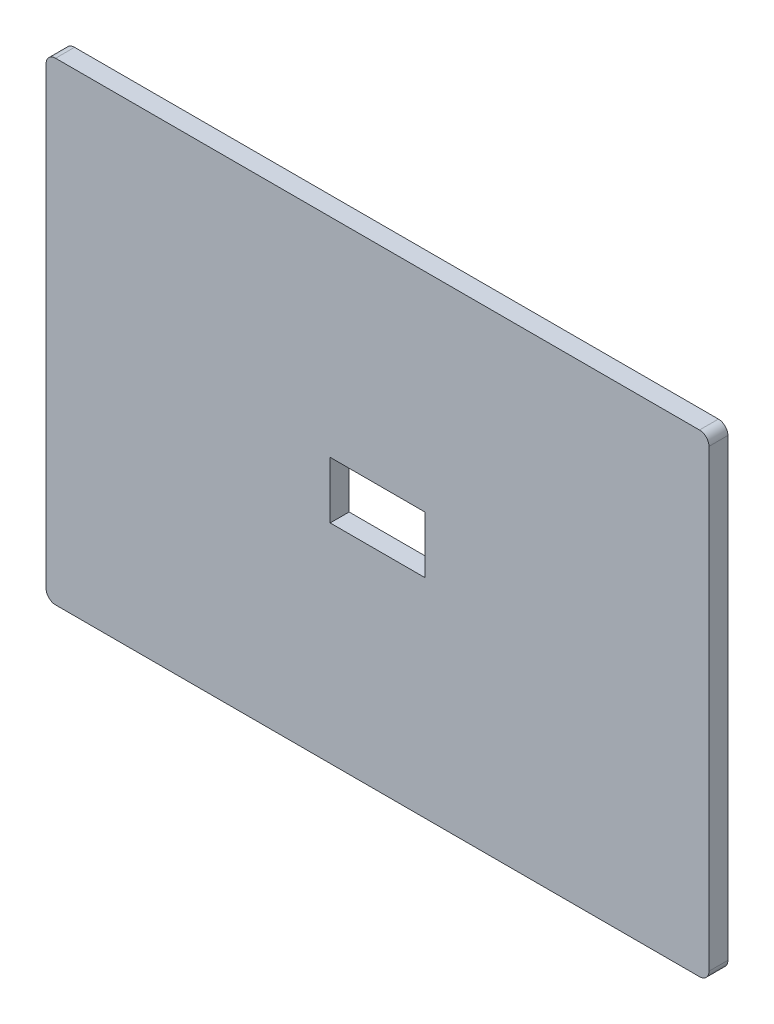
ISO-10303-21;
HEADER;
FILE_DESCRIPTION(('STEP AP214'),'2;1');
FILE_NAME('part.step','',(''),(''),'','','');
FILE_SCHEMA(('AUTOMOTIVE_DESIGN { 1 0 10303 214 1 1 1 1 }'));
ENDSEC;
DATA;
#1=APPLICATION_CONTEXT('core data for automotive mechanical design processes');
#2=APPLICATION_PROTOCOL_DEFINITION('international standard','automotive_design',2000,#1);
#3=PRODUCT_CONTEXT('',#1,'mechanical');
#4=PRODUCT('Part','Part','',(#3));
#5=PRODUCT_RELATED_PRODUCT_CATEGORY('part','',(#4));
#6=PRODUCT_DEFINITION_FORMATION('','',#4);
#7=PRODUCT_DEFINITION_CONTEXT('part definition',#1,'design');
#8=PRODUCT_DEFINITION('design','',#6,#7);
#9=PRODUCT_DEFINITION_SHAPE('','',#8);
#10=(LENGTH_UNIT() NAMED_UNIT(*) SI_UNIT(.MILLI.,.METRE.));
#11=(NAMED_UNIT(*) PLANE_ANGLE_UNIT() SI_UNIT($,.RADIAN.));
#12=(NAMED_UNIT(*) SI_UNIT($,.STERADIAN.) SOLID_ANGLE_UNIT());
#13=UNCERTAINTY_MEASURE_WITH_UNIT(LENGTH_MEASURE(1.E-05),#10,'distance_accuracy_value','');
#14=(GEOMETRIC_REPRESENTATION_CONTEXT(3) GLOBAL_UNCERTAINTY_ASSIGNED_CONTEXT((#13)) GLOBAL_UNIT_ASSIGNED_CONTEXT((#10,
#11,#12)) REPRESENTATION_CONTEXT('',''));
#15=CARTESIAN_POINT('',(0.,0.,0.));
#16=DIRECTION('',(0.,0.,1.));
#17=DIRECTION('',(1.,0.,0.));
#18=AXIS2_PLACEMENT_3D('',#15,#16,#17);
#19=CARTESIAN_POINT('',(-175.,125.,10.));
#20=DIRECTION('',(1.,0.,0.));
#21=DIRECTION('',(0.,1.,0.));
#22=AXIS2_PLACEMENT_3D('',#19,#20,#21);
#23=PLANE('',#22);
#24=DIRECTION('',(0.,-1.,0.));
#25=VECTOR('',#24,1.);
#26=CARTESIAN_POINT('',(-175.,125.,0.));
#27=LINE('',#26,#25);
#28=CARTESIAN_POINT('',(-175.,120.,0.));
#29=VERTEX_POINT('',#28);
#30=CARTESIAN_POINT('',(-175.,-120.,0.));
#31=VERTEX_POINT('',#30);
#32=EDGE_CURVE('E192',#29,#31,#27,.T.);
#33=ORIENTED_EDGE('',*,*,#32,.T.);
#34=DIRECTION('',(0.,0.,-1.));
#35=VECTOR('',#34,1.);
#36=CARTESIAN_POINT('',(-175.,-120.,10.));
#37=LINE('',#36,#35);
#38=CARTESIAN_POINT('',(-175.,-120.,10.));
#39=VERTEX_POINT('',#38);
#40=EDGE_CURVE('E250',#31,#39,#37,.F.);
#41=ORIENTED_EDGE('',*,*,#40,.T.);
#42=DIRECTION('',(0.,-1.,0.));
#43=VECTOR('',#42,1.);
#44=CARTESIAN_POINT('',(-175.,125.,10.));
#45=LINE('',#44,#43);
#46=CARTESIAN_POINT('',(-175.,120.,10.));
#47=VERTEX_POINT('',#46);
#48=EDGE_CURVE('E198',#47,#39,#45,.T.);
#49=ORIENTED_EDGE('',*,*,#48,.F.);
#50=DIRECTION('',(0.,0.,-1.));
#51=VECTOR('',#50,1.);
#52=CARTESIAN_POINT('',(-175.,120.,10.));
#53=LINE('',#52,#51);
#54=EDGE_CURVE('E247',#47,#29,#53,.T.);
#55=ORIENTED_EDGE('',*,*,#54,.T.);
#56=EDGE_LOOP('',(#33,#41,#49,#55));
#57=FACE_BOUND('',#56,.T.);
#58=ADVANCED_FACE('F39',(#57),#23,.F.);
#59=CARTESIAN_POINT('',(-175.,-125.,10.));
#60=DIRECTION('',(0.,1.,0.));
#61=DIRECTION('',(0.,0.,1.));
#62=AXIS2_PLACEMENT_3D('',#59,#60,#61);
#63=PLANE('',#62);
#64=DIRECTION('',(1.,0.,0.));
#65=VECTOR('',#64,1.);
#66=CARTESIAN_POINT('',(-175.,-125.,10.));
#67=LINE('',#66,#65);
#68=CARTESIAN_POINT('',(-170.,-125.,10.));
#69=VERTEX_POINT('',#68);
#70=CARTESIAN_POINT('',(170.,-125.,10.));
#71=VERTEX_POINT('',#70);
#72=EDGE_CURVE('E202',#69,#71,#67,.T.);
#73=ORIENTED_EDGE('',*,*,#72,.F.);
#74=DIRECTION('',(0.,0.,-1.));
#75=VECTOR('',#74,1.);
#76=CARTESIAN_POINT('',(-170.,-125.,10.));
#77=LINE('',#76,#75);
#78=CARTESIAN_POINT('',(-170.,-125.,0.));
#79=VERTEX_POINT('',#78);
#80=EDGE_CURVE('E232',#69,#79,#77,.T.);
#81=ORIENTED_EDGE('',*,*,#80,.T.);
#82=DIRECTION('',(1.,0.,0.));
#83=VECTOR('',#82,1.);
#84=CARTESIAN_POINT('',(-175.,-125.,0.));
#85=LINE('',#84,#83);
#86=CARTESIAN_POINT('',(170.,-125.,0.));
#87=VERTEX_POINT('',#86);
#88=EDGE_CURVE('E219',#79,#87,#85,.T.);
#89=ORIENTED_EDGE('',*,*,#88,.T.);
#90=DIRECTION('',(0.,0.,-1.));
#91=VECTOR('',#90,1.);
#92=CARTESIAN_POINT('',(170.,-125.,10.));
#93=LINE('',#92,#91);
#94=EDGE_CURVE('E215',#87,#71,#93,.F.);
#95=ORIENTED_EDGE('',*,*,#94,.T.);
#96=EDGE_LOOP('',(#73,#81,#89,#95));
#97=FACE_BOUND('',#96,.T.);
#98=ADVANCED_FACE('F293',(#97),#63,.F.);
#99=CARTESIAN_POINT('',(175.,125.,10.));
#100=DIRECTION('',(-1.,0.,0.));
#101=DIRECTION('',(0.,-1.,0.));
#102=AXIS2_PLACEMENT_3D('',#99,#100,#101);
#103=PLANE('',#102);
#104=DIRECTION('',(0.,1.,0.));
#105=VECTOR('',#104,1.);
#106=CARTESIAN_POINT('',(175.,125.,10.));
#107=LINE('',#106,#105);
#108=CARTESIAN_POINT('',(175.,-120.,10.));
#109=VERTEX_POINT('',#108);
#110=CARTESIAN_POINT('',(175.,120.,10.));
#111=VERTEX_POINT('',#110);
#112=EDGE_CURVE('E207',#109,#111,#107,.T.);
#113=ORIENTED_EDGE('',*,*,#112,.F.);
#114=DIRECTION('',(0.,0.,-1.));
#115=VECTOR('',#114,1.);
#116=CARTESIAN_POINT('',(175.,-120.,10.));
#117=LINE('',#116,#115);
#118=CARTESIAN_POINT('',(175.,-120.,0.));
#119=VERTEX_POINT('',#118);
#120=EDGE_CURVE('E267',#109,#119,#117,.T.);
#121=ORIENTED_EDGE('',*,*,#120,.T.);
#122=DIRECTION('',(0.,1.,0.));
#123=VECTOR('',#122,1.);
#124=CARTESIAN_POINT('',(175.,125.,0.));
#125=LINE('',#124,#123);
#126=CARTESIAN_POINT('',(175.,120.,0.));
#127=VERTEX_POINT('',#126);
#128=EDGE_CURVE('E223',#119,#127,#125,.T.);
#129=ORIENTED_EDGE('',*,*,#128,.T.);
#130=DIRECTION('',(0.,0.,-1.));
#131=VECTOR('',#130,1.);
#132=CARTESIAN_POINT('',(175.,120.,10.));
#133=LINE('',#132,#131);
#134=EDGE_CURVE('E264',#127,#111,#133,.F.);
#135=ORIENTED_EDGE('',*,*,#134,.T.);
#136=EDGE_LOOP('',(#113,#121,#129,#135));
#137=FACE_BOUND('',#136,.T.);
#138=ADVANCED_FACE('F302',(#137),#103,.F.);
#139=CARTESIAN_POINT('',(-175.,125.,10.));
#140=DIRECTION('',(0.,-1.,0.));
#141=DIRECTION('',(0.,0.,-1.));
#142=AXIS2_PLACEMENT_3D('',#139,#140,#141);
#143=PLANE('',#142);
#144=DIRECTION('',(-1.,0.,0.));
#145=VECTOR('',#144,1.);
#146=CARTESIAN_POINT('',(-175.,125.,10.));
#147=LINE('',#146,#145);
#148=CARTESIAN_POINT('',(170.,125.,10.));
#149=VERTEX_POINT('',#148);
#150=CARTESIAN_POINT('',(-170.,125.,10.));
#151=VERTEX_POINT('',#150);
#152=EDGE_CURVE('E211',#149,#151,#147,.T.);
#153=ORIENTED_EDGE('',*,*,#152,.F.);
#154=DIRECTION('',(0.,0.,-1.));
#155=VECTOR('',#154,1.);
#156=CARTESIAN_POINT('',(170.,125.,10.));
#157=LINE('',#156,#155);
#158=CARTESIAN_POINT('',(170.,125.,0.));
#159=VERTEX_POINT('',#158);
#160=EDGE_CURVE('E11',#149,#159,#157,.T.);
#161=ORIENTED_EDGE('',*,*,#160,.T.);
#162=DIRECTION('',(-1.,0.,0.));
#163=VECTOR('',#162,1.);
#164=CARTESIAN_POINT('',(-175.,125.,0.));
#165=LINE('',#164,#163);
#166=CARTESIAN_POINT('',(-170.,125.,0.));
#167=VERTEX_POINT('',#166);
#168=EDGE_CURVE('E203',#159,#167,#165,.T.);
#169=ORIENTED_EDGE('',*,*,#168,.T.);
#170=DIRECTION('',(0.,0.,-1.));
#171=VECTOR('',#170,1.);
#172=CARTESIAN_POINT('',(-170.,125.,10.));
#173=LINE('',#172,#171);
#174=EDGE_CURVE('E48',#167,#151,#173,.F.);
#175=ORIENTED_EDGE('',*,*,#174,.T.);
#176=EDGE_LOOP('',(#153,#161,#169,#175));
#177=FACE_BOUND('',#176,.T.);
#178=ADVANCED_FACE('F273',(#177),#143,.F.);
#179=CARTESIAN_POINT('',(0.,0.,10.));
#180=DIRECTION('',(0.,0.,1.));
#181=DIRECTION('',(1.,0.,0.));
#182=AXIS2_PLACEMENT_3D('',#179,#180,#181);
#183=PLANE('',#182);
#184=DIRECTION('',(0.,-1.,0.));
#185=VECTOR('',#184,1.);
#186=CARTESIAN_POINT('',(-25.,-15.,10.));
#187=LINE('',#186,#185);
#188=CARTESIAN_POINT('',(-25.,15.,10.));
#189=VERTEX_POINT('',#188);
#190=CARTESIAN_POINT('',(-25.,-15.,10.));
#191=VERTEX_POINT('',#190);
#192=EDGE_CURVE('E58',#189,#191,#187,.T.);
#193=ORIENTED_EDGE('',*,*,#192,.F.);
#194=DIRECTION('',(-1.,0.,0.));
#195=VECTOR('',#194,1.);
#196=CARTESIAN_POINT('',(-25.,15.,10.));
#197=LINE('',#196,#195);
#198=CARTESIAN_POINT('',(25.,15.,10.));
#199=VERTEX_POINT('',#198);
#200=EDGE_CURVE('E170',#199,#189,#197,.T.);
#201=ORIENTED_EDGE('',*,*,#200,.F.);
#202=DIRECTION('',(0.,1.,0.));
#203=VECTOR('',#202,1.);
#204=CARTESIAN_POINT('',(25.,-15.,10.));
#205=LINE('',#204,#203);
#206=CARTESIAN_POINT('',(25.,-15.,10.));
#207=VERTEX_POINT('',#206);
#208=EDGE_CURVE('E175',#207,#199,#205,.T.);
#209=ORIENTED_EDGE('',*,*,#208,.F.);
#210=DIRECTION('',(1.,0.,0.));
#211=VECTOR('',#210,1.);
#212=CARTESIAN_POINT('',(-25.,-15.,10.));
#213=LINE('',#212,#211);
#214=EDGE_CURVE('E184',#191,#207,#213,.T.);
#215=ORIENTED_EDGE('',*,*,#214,.F.);
#216=EDGE_LOOP('',(#193,#201,#209,#215));
#217=FACE_BOUND('',#216,.T.);
#218=ORIENTED_EDGE('',*,*,#48,.T.);
#219=CARTESIAN_POINT('',(-170.,-120.,10.));
#220=DIRECTION('',(0.,0.,1.));
#221=DIRECTION('',(1.,0.,0.));
#222=AXIS2_PLACEMENT_3D('',#219,#220,#221);
#223=CIRCLE('',#222,5.);
#224=EDGE_CURVE('E261',#39,#69,#223,.T.);
#225=ORIENTED_EDGE('',*,*,#224,.T.);
#226=ORIENTED_EDGE('',*,*,#72,.T.);
#227=CARTESIAN_POINT('',(170.,-120.,10.));
#228=DIRECTION('',(0.,0.,1.));
#229=DIRECTION('',(1.,0.,0.));
#230=AXIS2_PLACEMENT_3D('',#227,#228,#229);
#231=CIRCLE('',#230,5.);
#232=EDGE_CURVE('E258',#71,#109,#231,.T.);
#233=ORIENTED_EDGE('',*,*,#232,.T.);
#234=ORIENTED_EDGE('',*,*,#112,.T.);
#235=CARTESIAN_POINT('',(170.,120.,10.));
#236=DIRECTION('',(0.,0.,1.));
#237=DIRECTION('',(1.,0.,0.));
#238=AXIS2_PLACEMENT_3D('',#235,#236,#237);
#239=CIRCLE('',#238,5.);
#240=EDGE_CURVE('E255',#111,#149,#239,.T.);
#241=ORIENTED_EDGE('',*,*,#240,.T.);
#242=ORIENTED_EDGE('',*,*,#152,.T.);
#243=CARTESIAN_POINT('',(-170.,120.,10.));
#244=DIRECTION('',(0.,0.,1.));
#245=DIRECTION('',(1.,0.,0.));
#246=AXIS2_PLACEMENT_3D('',#243,#244,#245);
#247=CIRCLE('',#246,5.);
#248=EDGE_CURVE('E253',#151,#47,#247,.T.);
#249=ORIENTED_EDGE('',*,*,#248,.T.);
#250=EDGE_LOOP('',(#218,#225,#226,#233,#234,#241,#242,#249));
#251=FACE_BOUND('',#250,.T.);
#252=ADVANCED_FACE('F279',(#217,#251),#183,.T.);
#253=CARTESIAN_POINT('',(0.,0.,0.));
#254=DIRECTION('',(0.,0.,1.));
#255=DIRECTION('',(1.,0.,0.));
#256=AXIS2_PLACEMENT_3D('',#253,#254,#255);
#257=PLANE('',#256);
#258=DIRECTION('',(-1.,0.,0.));
#259=VECTOR('',#258,1.);
#260=CARTESIAN_POINT('',(-25.,15.,0.));
#261=LINE('',#260,#259);
#262=CARTESIAN_POINT('',(25.,15.,0.));
#263=VERTEX_POINT('',#262);
#264=CARTESIAN_POINT('',(-25.,15.,0.));
#265=VERTEX_POINT('',#264);
#266=EDGE_CURVE('E158',#263,#265,#261,.T.);
#267=ORIENTED_EDGE('',*,*,#266,.T.);
#268=DIRECTION('',(0.,-1.,0.));
#269=VECTOR('',#268,1.);
#270=CARTESIAN_POINT('',(-25.,-15.,0.));
#271=LINE('',#270,#269);
#272=CARTESIAN_POINT('',(-25.,-15.,0.));
#273=VERTEX_POINT('',#272);
#274=EDGE_CURVE('E151',#265,#273,#271,.T.);
#275=ORIENTED_EDGE('',*,*,#274,.T.);
#276=DIRECTION('',(1.,0.,0.));
#277=VECTOR('',#276,1.);
#278=CARTESIAN_POINT('',(-25.,-15.,0.));
#279=LINE('',#278,#277);
#280=CARTESIAN_POINT('',(25.,-15.,0.));
#281=VERTEX_POINT('',#280);
#282=EDGE_CURVE('E161',#273,#281,#279,.T.);
#283=ORIENTED_EDGE('',*,*,#282,.T.);
#284=DIRECTION('',(0.,1.,0.));
#285=VECTOR('',#284,1.);
#286=CARTESIAN_POINT('',(25.,-15.,0.));
#287=LINE('',#286,#285);
#288=EDGE_CURVE('E68',#281,#263,#287,.T.);
#289=ORIENTED_EDGE('',*,*,#288,.T.);
#290=EDGE_LOOP('',(#267,#275,#283,#289));
#291=FACE_BOUND('',#290,.T.);
#292=ORIENTED_EDGE('',*,*,#88,.F.);
#293=CARTESIAN_POINT('',(-170.,-120.,0.));
#294=DIRECTION('',(0.,0.,1.));
#295=DIRECTION('',(1.,0.,0.));
#296=AXIS2_PLACEMENT_3D('',#293,#294,#295);
#297=CIRCLE('',#296,5.);
#298=EDGE_CURVE('E244',#79,#31,#297,.F.);
#299=ORIENTED_EDGE('',*,*,#298,.T.);
#300=ORIENTED_EDGE('',*,*,#32,.F.);
#301=CARTESIAN_POINT('',(-170.,120.,0.));
#302=DIRECTION('',(0.,0.,1.));
#303=DIRECTION('',(1.,0.,0.));
#304=AXIS2_PLACEMENT_3D('',#301,#302,#303);
#305=CIRCLE('',#304,5.);
#306=EDGE_CURVE('E236',#29,#167,#305,.F.);
#307=ORIENTED_EDGE('',*,*,#306,.T.);
#308=ORIENTED_EDGE('',*,*,#168,.F.);
#309=CARTESIAN_POINT('',(170.,120.,0.));
#310=DIRECTION('',(0.,0.,1.));
#311=DIRECTION('',(1.,0.,0.));
#312=AXIS2_PLACEMENT_3D('',#309,#310,#311);
#313=CIRCLE('',#312,5.);
#314=EDGE_CURVE('E238',#159,#127,#313,.F.);
#315=ORIENTED_EDGE('',*,*,#314,.T.);
#316=ORIENTED_EDGE('',*,*,#128,.F.);
#317=CARTESIAN_POINT('',(170.,-120.,0.));
#318=DIRECTION('',(0.,0.,1.));
#319=DIRECTION('',(1.,0.,0.));
#320=AXIS2_PLACEMENT_3D('',#317,#318,#319);
#321=CIRCLE('',#320,5.);
#322=EDGE_CURVE('E241',#119,#87,#321,.F.);
#323=ORIENTED_EDGE('',*,*,#322,.T.);
#324=EDGE_LOOP('',(#292,#299,#300,#307,#308,#315,#316,#323));
#325=FACE_BOUND('',#324,.T.);
#326=ADVANCED_FACE('F166',(#291,#325),#257,.F.);
#327=CARTESIAN_POINT('',(-170.,-120.,10.));
#328=DIRECTION('',(0.,0.,-1.));
#329=DIRECTION('',(-1.,0.,0.));
#330=AXIS2_PLACEMENT_3D('',#327,#328,#329);
#331=CYLINDRICAL_SURFACE('',#330,5.);
#332=ORIENTED_EDGE('',*,*,#224,.F.);
#333=ORIENTED_EDGE('',*,*,#40,.F.);
#334=ORIENTED_EDGE('',*,*,#298,.F.);
#335=ORIENTED_EDGE('',*,*,#80,.F.);
#336=EDGE_LOOP('',(#332,#333,#334,#335));
#337=FACE_BOUND('',#336,.T.);
#338=ADVANCED_FACE('F290',(#337),#331,.T.);
#339=CARTESIAN_POINT('',(170.,-120.,10.));
#340=DIRECTION('',(0.,0.,-1.));
#341=DIRECTION('',(-1.,0.,0.));
#342=AXIS2_PLACEMENT_3D('',#339,#340,#341);
#343=CYLINDRICAL_SURFACE('',#342,5.);
#344=ORIENTED_EDGE('',*,*,#232,.F.);
#345=ORIENTED_EDGE('',*,*,#94,.F.);
#346=ORIENTED_EDGE('',*,*,#322,.F.);
#347=ORIENTED_EDGE('',*,*,#120,.F.);
#348=EDGE_LOOP('',(#344,#345,#346,#347));
#349=FACE_BOUND('',#348,.T.);
#350=ADVANCED_FACE('F299',(#349),#343,.T.);
#351=CARTESIAN_POINT('',(170.,120.,10.));
#352=DIRECTION('',(0.,0.,-1.));
#353=DIRECTION('',(-1.,0.,0.));
#354=AXIS2_PLACEMENT_3D('',#351,#352,#353);
#355=CYLINDRICAL_SURFACE('',#354,5.);
#356=ORIENTED_EDGE('',*,*,#240,.F.);
#357=ORIENTED_EDGE('',*,*,#134,.F.);
#358=ORIENTED_EDGE('',*,*,#314,.F.);
#359=ORIENTED_EDGE('',*,*,#160,.F.);
#360=EDGE_LOOP('',(#356,#357,#358,#359));
#361=FACE_BOUND('',#360,.T.);
#362=ADVANCED_FACE('F305',(#361),#355,.T.);
#363=CARTESIAN_POINT('',(-170.,120.,10.));
#364=DIRECTION('',(0.,0.,-1.));
#365=DIRECTION('',(-1.,0.,0.));
#366=AXIS2_PLACEMENT_3D('',#363,#364,#365);
#367=CYLINDRICAL_SURFACE('',#366,5.);
#368=ORIENTED_EDGE('',*,*,#248,.F.);
#369=ORIENTED_EDGE('',*,*,#174,.F.);
#370=ORIENTED_EDGE('',*,*,#306,.F.);
#371=ORIENTED_EDGE('',*,*,#54,.F.);
#372=EDGE_LOOP('',(#368,#369,#370,#371));
#373=FACE_BOUND('',#372,.T.);
#374=ADVANCED_FACE('F41',(#373),#367,.T.);
#375=CARTESIAN_POINT('',(-25.,-15.,0.));
#376=DIRECTION('',(-1.,0.,0.));
#377=DIRECTION('',(0.,0.,1.));
#378=AXIS2_PLACEMENT_3D('',#375,#376,#377);
#379=PLANE('',#378);
#380=ORIENTED_EDGE('',*,*,#192,.T.);
#381=DIRECTION('',(0.,0.,1.));
#382=VECTOR('',#381,1.);
#383=CARTESIAN_POINT('',(-25.,-15.,0.));
#384=LINE('',#383,#382);
#385=EDGE_CURVE('E147',#273,#191,#384,.T.);
#386=ORIENTED_EDGE('',*,*,#385,.F.);
#387=ORIENTED_EDGE('',*,*,#274,.F.);
#388=DIRECTION('',(0.,0.,1.));
#389=VECTOR('',#388,1.);
#390=CARTESIAN_POINT('',(-25.,15.,0.));
#391=LINE('',#390,#389);
#392=EDGE_CURVE('E189',#265,#189,#391,.T.);
#393=ORIENTED_EDGE('',*,*,#392,.T.);
#394=EDGE_LOOP('',(#380,#386,#387,#393));
#395=FACE_BOUND('',#394,.T.);
#396=ADVANCED_FACE('F149',(#395),#379,.F.);
#397=CARTESIAN_POINT('',(-25.,15.,0.));
#398=DIRECTION('',(0.,1.,0.));
#399=DIRECTION('',(-1.,0.,0.));
#400=AXIS2_PLACEMENT_3D('',#397,#398,#399);
#401=PLANE('',#400);
#402=ORIENTED_EDGE('',*,*,#200,.T.);
#403=ORIENTED_EDGE('',*,*,#392,.F.);
#404=ORIENTED_EDGE('',*,*,#266,.F.);
#405=DIRECTION('',(0.,0.,1.));
#406=VECTOR('',#405,1.);
#407=CARTESIAN_POINT('',(25.,15.,0.));
#408=LINE('',#407,#406);
#409=EDGE_CURVE('E193',#263,#199,#408,.T.);
#410=ORIENTED_EDGE('',*,*,#409,.T.);
#411=EDGE_LOOP('',(#402,#403,#404,#410));
#412=FACE_BOUND('',#411,.T.);
#413=ADVANCED_FACE('F361',(#412),#401,.F.);
#414=CARTESIAN_POINT('',(25.,-15.,0.));
#415=DIRECTION('',(1.,0.,0.));
#416=DIRECTION('',(0.,1.,0.));
#417=AXIS2_PLACEMENT_3D('',#414,#415,#416);
#418=PLANE('',#417);
#419=ORIENTED_EDGE('',*,*,#208,.T.);
#420=ORIENTED_EDGE('',*,*,#409,.F.);
#421=ORIENTED_EDGE('',*,*,#288,.F.);
#422=DIRECTION('',(0.,0.,1.));
#423=VECTOR('',#422,1.);
#424=CARTESIAN_POINT('',(25.,-15.,0.));
#425=LINE('',#424,#423);
#426=EDGE_CURVE('E157',#281,#207,#425,.T.);
#427=ORIENTED_EDGE('',*,*,#426,.T.);
#428=EDGE_LOOP('',(#419,#420,#421,#427));
#429=FACE_BOUND('',#428,.T.);
#430=ADVANCED_FACE('F370',(#429),#418,.F.);
#431=CARTESIAN_POINT('',(-25.,-15.,0.));
#432=DIRECTION('',(0.,-1.,0.));
#433=DIRECTION('',(0.,0.,-1.));
#434=AXIS2_PLACEMENT_3D('',#431,#432,#433);
#435=PLANE('',#434);
#436=ORIENTED_EDGE('',*,*,#214,.T.);
#437=ORIENTED_EDGE('',*,*,#426,.F.);
#438=ORIENTED_EDGE('',*,*,#282,.F.);
#439=ORIENTED_EDGE('',*,*,#385,.T.);
#440=EDGE_LOOP('',(#436,#437,#438,#439));
#441=FACE_BOUND('',#440,.T.);
#442=ADVANCED_FACE('F162',(#441),#435,.F.);
#443=CLOSED_SHELL('',(#58,#98,#138,#178,#252,#326,#338,#350,#362,#374,#396,#413,#430,#442));
#444=MANIFOLD_SOLID_BREP('B2',#443);
#445=ADVANCED_BREP_SHAPE_REPRESENTATION('',(#18,#444),#14);
#446=SHAPE_DEFINITION_REPRESENTATION(#9,#445);
ENDSEC;
END-ISO-10303-21;
